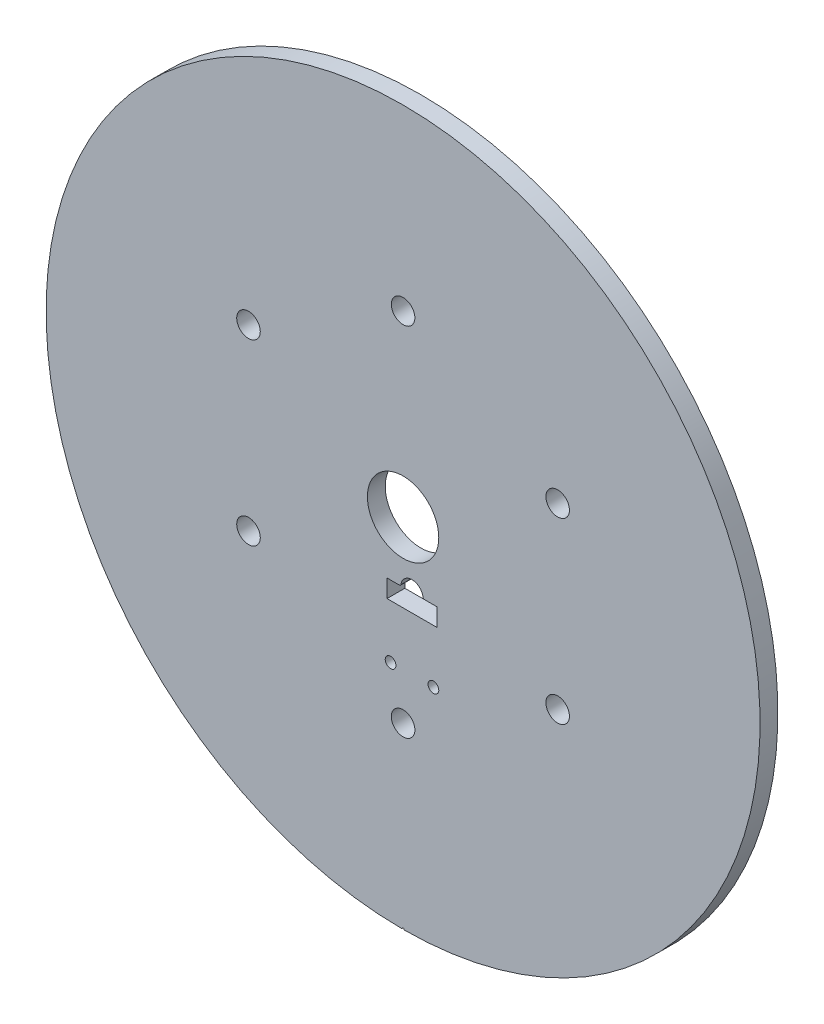
ISO-10303-21;
HEADER;
FILE_DESCRIPTION(('STEP AP214'),'2;1');
FILE_NAME('part.step','',(''),(''),'','','');
FILE_SCHEMA(('AUTOMOTIVE_DESIGN { 1 0 10303 214 1 1 1 1 }'));
ENDSEC;
DATA;
#1=APPLICATION_CONTEXT('core data for automotive mechanical design processes');
#2=APPLICATION_PROTOCOL_DEFINITION('international standard','automotive_design',2000,#1);
#3=PRODUCT_CONTEXT('',#1,'mechanical');
#4=PRODUCT('Part','Part','',(#3));
#5=PRODUCT_RELATED_PRODUCT_CATEGORY('part','',(#4));
#6=PRODUCT_DEFINITION_FORMATION('','',#4);
#7=PRODUCT_DEFINITION_CONTEXT('part definition',#1,'design');
#8=PRODUCT_DEFINITION('design','',#6,#7);
#9=PRODUCT_DEFINITION_SHAPE('','',#8);
#10=(LENGTH_UNIT() NAMED_UNIT(*) SI_UNIT(.MILLI.,.METRE.));
#11=(NAMED_UNIT(*) PLANE_ANGLE_UNIT() SI_UNIT($,.RADIAN.));
#12=(NAMED_UNIT(*) SI_UNIT($,.STERADIAN.) SOLID_ANGLE_UNIT());
#13=UNCERTAINTY_MEASURE_WITH_UNIT(LENGTH_MEASURE(1.E-05),#10,'distance_accuracy_value','');
#14=(GEOMETRIC_REPRESENTATION_CONTEXT(3) GLOBAL_UNCERTAINTY_ASSIGNED_CONTEXT((#13)) GLOBAL_UNIT_ASSIGNED_CONTEXT((#10,
#11,#12)) REPRESENTATION_CONTEXT('',''));
#15=CARTESIAN_POINT('',(0.,0.,0.));
#16=DIRECTION('',(0.,0.,1.));
#17=DIRECTION('',(1.,0.,0.));
#18=AXIS2_PLACEMENT_3D('',#15,#16,#17);
#19=CARTESIAN_POINT('',(0.,0.,5.));
#20=DIRECTION('',(0.,0.,1.));
#21=DIRECTION('',(1.,0.,0.));
#22=AXIS2_PLACEMENT_3D('',#19,#20,#21);
#23=PLANE('',#22);
#24=CARTESIAN_POINT('',(0.,0.,5.));
#25=DIRECTION('',(0.,0.,1.));
#26=DIRECTION('',(1.,0.,0.));
#27=AXIS2_PLACEMENT_3D('',#24,#25,#26);
#28=CIRCLE('',#27,10.0000000000051);
#29=CARTESIAN_POINT('',(10.0000000000051,0.,5.));
#30=VERTEX_POINT('',#29);
#31=EDGE_CURVE('E526',#30,#30,#28,.T.);
#32=ORIENTED_EDGE('',*,*,#31,.F.);
#33=EDGE_LOOP('',(#32));
#34=FACE_BOUND('',#33,.T.);
#35=CARTESIAN_POINT('',(8.5,-37.,5.));
#36=DIRECTION('',(0.,0.,-1.));
#37=DIRECTION('',(-1.,0.,0.));
#38=AXIS2_PLACEMENT_3D('',#35,#36,#37);
#39=CIRCLE('',#38,1.5);
#40=CARTESIAN_POINT('',(7.,-37.,5.));
#41=VERTEX_POINT('',#40);
#42=EDGE_CURVE('E536',#41,#41,#39,.T.);
#43=ORIENTED_EDGE('',*,*,#42,.T.);
#44=EDGE_LOOP('',(#43));
#45=FACE_BOUND('',#44,.T.);
#46=CARTESIAN_POINT('',(-3.5,-37.,5.));
#47=DIRECTION('',(0.,0.,-1.));
#48=DIRECTION('',(-1.,0.,0.));
#49=AXIS2_PLACEMENT_3D('',#46,#47,#48);
#50=CIRCLE('',#49,1.5);
#51=CARTESIAN_POINT('',(-5.,-37.,5.));
#52=VERTEX_POINT('',#51);
#53=EDGE_CURVE('E544',#52,#52,#50,.T.);
#54=ORIENTED_EDGE('',*,*,#53,.T.);
#55=EDGE_LOOP('',(#54));
#56=FACE_BOUND('',#55,.T.);
#57=DIRECTION('',(-1.,0.,0.));
#58=VECTOR('',#57,1.);
#59=CARTESIAN_POINT('',(9.5,-17.,5.));
#60=LINE('',#59,#58);
#61=CARTESIAN_POINT('',(-1.06510869399518,-17.,5.));
#62=VERTEX_POINT('',#61);
#63=CARTESIAN_POINT('',(-4.5,-17.,5.));
#64=VERTEX_POINT('',#63);
#65=EDGE_CURVE('E178',#62,#64,#60,.T.);
#66=ORIENTED_EDGE('',*,*,#65,.F.);
#67=CARTESIAN_POINT('',(-1.06510869399518,-16.5,5.));
#68=DIRECTION('',(0.,0.,1.));
#69=DIRECTION('',(1.,0.,0.));
#70=AXIS2_PLACEMENT_3D('',#67,#68,#69);
#71=CIRCLE('',#70,0.5);
#72=CARTESIAN_POINT('',(-0.56995470871807,-16.5694444444444,5.));
#73=VERTEX_POINT('',#72);
#74=EDGE_CURVE('E54',#62,#73,#71,.T.);
#75=ORIENTED_EDGE('',*,*,#74,.T.);
#76=CARTESIAN_POINT('',(2.5,-17.,5.));
#77=DIRECTION('',(0.,0.,-1.));
#78=DIRECTION('',(-1.,0.,0.));
#79=AXIS2_PLACEMENT_3D('',#76,#77,#78);
#80=CIRCLE('',#79,3.1);
#81=CARTESIAN_POINT('',(5.56995470871807,-16.5694444444444,5.));
#82=VERTEX_POINT('',#81);
#83=EDGE_CURVE('E176',#73,#82,#80,.T.);
#84=ORIENTED_EDGE('',*,*,#83,.T.);
#85=CARTESIAN_POINT('',(6.06510869399518,-16.5,5.));
#86=DIRECTION('',(0.,0.,1.));
#87=DIRECTION('',(1.,0.,0.));
#88=AXIS2_PLACEMENT_3D('',#85,#86,#87);
#89=CIRCLE('',#88,0.5);
#90=CARTESIAN_POINT('',(6.06510869399518,-17.,5.));
#91=VERTEX_POINT('',#90);
#92=EDGE_CURVE('E61',#82,#91,#89,.T.);
#93=ORIENTED_EDGE('',*,*,#92,.T.);
#94=CARTESIAN_POINT('',(9.5,-17.,5.));
#95=VERTEX_POINT('',#94);
#96=EDGE_CURVE('E216',#95,#91,#60,.T.);
#97=ORIENTED_EDGE('',*,*,#96,.F.);
#98=DIRECTION('',(0.,1.,0.));
#99=VECTOR('',#98,1.);
#100=CARTESIAN_POINT('',(9.5,-17.,5.));
#101=LINE('',#100,#99);
#102=CARTESIAN_POINT('',(9.5,-22.,5.));
#103=VERTEX_POINT('',#102);
#104=EDGE_CURVE('E560',#103,#95,#101,.T.);
#105=ORIENTED_EDGE('',*,*,#104,.F.);
#106=DIRECTION('',(1.,0.,0.));
#107=VECTOR('',#106,1.);
#108=CARTESIAN_POINT('',(9.5,-22.,5.));
#109=LINE('',#108,#107);
#110=CARTESIAN_POINT('',(-4.5,-22.,5.));
#111=VERTEX_POINT('',#110);
#112=EDGE_CURVE('E557',#111,#103,#109,.T.);
#113=ORIENTED_EDGE('',*,*,#112,.F.);
#114=DIRECTION('',(0.,-1.,0.));
#115=VECTOR('',#114,1.);
#116=CARTESIAN_POINT('',(-4.5,-17.,5.));
#117=LINE('',#116,#115);
#118=EDGE_CURVE('E207',#64,#111,#117,.T.);
#119=ORIENTED_EDGE('',*,*,#118,.F.);
#120=EDGE_LOOP('',(#66,#75,#84,#93,#97,#105,#113,#119));
#121=FACE_BOUND('',#120,.T.);
#122=CARTESIAN_POINT('',(0.,50.,5.));
#123=DIRECTION('',(0.,0.,1.));
#124=DIRECTION('',(1.,0.,0.));
#125=AXIS2_PLACEMENT_3D('',#122,#123,#124);
#126=CIRCLE('',#125,3.3);
#127=CARTESIAN_POINT('',(3.3,50.,5.));
#128=VERTEX_POINT('',#127);
#129=EDGE_CURVE('E226',#128,#128,#126,.T.);
#130=ORIENTED_EDGE('',*,*,#129,.F.);
#131=EDGE_LOOP('',(#130));
#132=FACE_BOUND('',#131,.T.);
#133=CARTESIAN_POINT('',(43.301270189222,24.9999999999999,5.));
#134=DIRECTION('',(0.,0.,1.));
#135=DIRECTION('',(1.,0.,0.));
#136=AXIS2_PLACEMENT_3D('',#133,#134,#135);
#137=CIRCLE('',#136,3.3);
#138=CARTESIAN_POINT('',(46.601270189222,24.9999999999999,5.));
#139=VERTEX_POINT('',#138);
#140=EDGE_CURVE('E234',#139,#139,#137,.T.);
#141=ORIENTED_EDGE('',*,*,#140,.F.);
#142=EDGE_LOOP('',(#141));
#143=FACE_BOUND('',#142,.T.);
#144=CARTESIAN_POINT('',(43.3012701892218,-25.0000000000002,5.));
#145=DIRECTION('',(0.,0.,1.));
#146=DIRECTION('',(1.,0.,0.));
#147=AXIS2_PLACEMENT_3D('',#144,#145,#146);
#148=CIRCLE('',#147,3.3);
#149=CARTESIAN_POINT('',(46.6012701892218,-25.0000000000002,5.));
#150=VERTEX_POINT('',#149);
#151=EDGE_CURVE('E242',#150,#150,#148,.T.);
#152=ORIENTED_EDGE('',*,*,#151,.F.);
#153=EDGE_LOOP('',(#152));
#154=FACE_BOUND('',#153,.T.);
#155=CARTESIAN_POINT('',(0.,-50.,5.));
#156=DIRECTION('',(0.,0.,1.));
#157=DIRECTION('',(1.,0.,0.));
#158=AXIS2_PLACEMENT_3D('',#155,#156,#157);
#159=CIRCLE('',#158,3.3);
#160=CARTESIAN_POINT('',(3.3,-50.,5.));
#161=VERTEX_POINT('',#160);
#162=EDGE_CURVE('E250',#161,#161,#159,.T.);
#163=ORIENTED_EDGE('',*,*,#162,.F.);
#164=EDGE_LOOP('',(#163));
#165=FACE_BOUND('',#164,.T.);
#166=CARTESIAN_POINT('',(-43.3012701892222,-24.9999999999996,5.));
#167=DIRECTION('',(0.,0.,1.));
#168=DIRECTION('',(1.,0.,0.));
#169=AXIS2_PLACEMENT_3D('',#166,#167,#168);
#170=CIRCLE('',#169,3.3);
#171=CARTESIAN_POINT('',(-40.0012701892222,-24.9999999999996,5.));
#172=VERTEX_POINT('',#171);
#173=EDGE_CURVE('E258',#172,#172,#170,.T.);
#174=ORIENTED_EDGE('',*,*,#173,.F.);
#175=EDGE_LOOP('',(#174));
#176=FACE_BOUND('',#175,.T.);
#177=CARTESIAN_POINT('',(-43.3012701892216,25.0000000000005,5.));
#178=DIRECTION('',(0.,0.,1.));
#179=DIRECTION('',(1.,0.,0.));
#180=AXIS2_PLACEMENT_3D('',#177,#178,#179);
#181=CIRCLE('',#180,3.3);
#182=CARTESIAN_POINT('',(-40.0012701892216,25.0000000000005,5.));
#183=VERTEX_POINT('',#182);
#184=EDGE_CURVE('E265',#183,#183,#181,.T.);
#185=ORIENTED_EDGE('',*,*,#184,.F.);
#186=EDGE_LOOP('',(#185));
#187=FACE_BOUND('',#186,.T.);
#188=CARTESIAN_POINT('',(0.,0.,5.));
#189=DIRECTION('',(0.,0.,1.));
#190=DIRECTION('',(1.,0.,0.));
#191=AXIS2_PLACEMENT_3D('',#188,#189,#190);
#192=CIRCLE('',#191,100.);
#193=CARTESIAN_POINT('',(0.330199549969947,-99.9994548398,5.));
#194=VERTEX_POINT('',#193);
#195=CARTESIAN_POINT('',(-0.330199549969947,-99.9994548398,5.));
#196=VERTEX_POINT('',#195);
#197=EDGE_CURVE('E140',#194,#196,#192,.T.);
#198=ORIENTED_EDGE('',*,*,#197,.T.);
#199=CARTESIAN_POINT('',(0.,-100.,5.));
#200=DIRECTION('',(0.,0.,-1.));
#201=DIRECTION('',(-1.,0.,0.));
#202=AXIS2_PLACEMENT_3D('',#199,#200,#201);
#203=CIRCLE('',#202,0.330199999999999);
#204=EDGE_CURVE('E123',#196,#194,#203,.T.);
#205=ORIENTED_EDGE('',*,*,#204,.T.);
#206=EDGE_LOOP('',(#198,#205));
#207=FACE_BOUND('',#206,.T.);
#208=ADVANCED_FACE('F45',(#34,#45,#56,#121,#132,#143,#154,#165,#176,#187,#207),#23,.T.);
#209=CARTESIAN_POINT('',(0.,0.,0.));
#210=DIRECTION('',(0.,0.,1.));
#211=DIRECTION('',(1.,0.,0.));
#212=AXIS2_PLACEMENT_3D('',#209,#210,#211);
#213=PLANE('',#212);
#214=CARTESIAN_POINT('',(0.,0.,0.));
#215=DIRECTION('',(0.,0.,1.));
#216=DIRECTION('',(1.,0.,0.));
#217=AXIS2_PLACEMENT_3D('',#214,#215,#216);
#218=CIRCLE('',#217,10.0000000000051);
#219=CARTESIAN_POINT('',(10.0000000000051,0.,0.));
#220=VERTEX_POINT('',#219);
#221=EDGE_CURVE('E529',#220,#220,#218,.T.);
#222=ORIENTED_EDGE('',*,*,#221,.T.);
#223=EDGE_LOOP('',(#222));
#224=FACE_BOUND('',#223,.T.);
#225=CARTESIAN_POINT('',(8.5,-37.,0.));
#226=DIRECTION('',(0.,0.,-1.));
#227=DIRECTION('',(-1.,0.,0.));
#228=AXIS2_PLACEMENT_3D('',#225,#226,#227);
#229=CIRCLE('',#228,1.5);
#230=CARTESIAN_POINT('',(7.,-37.,0.));
#231=VERTEX_POINT('',#230);
#232=EDGE_CURVE('E540',#231,#231,#229,.T.);
#233=ORIENTED_EDGE('',*,*,#232,.F.);
#234=EDGE_LOOP('',(#233));
#235=FACE_BOUND('',#234,.T.);
#236=CARTESIAN_POINT('',(-3.5,-37.,0.));
#237=DIRECTION('',(0.,0.,-1.));
#238=DIRECTION('',(-1.,0.,0.));
#239=AXIS2_PLACEMENT_3D('',#236,#237,#238);
#240=CIRCLE('',#239,1.5);
#241=CARTESIAN_POINT('',(-5.,-37.,0.));
#242=VERTEX_POINT('',#241);
#243=EDGE_CURVE('E533',#242,#242,#240,.T.);
#244=ORIENTED_EDGE('',*,*,#243,.F.);
#245=EDGE_LOOP('',(#244));
#246=FACE_BOUND('',#245,.T.);
#247=CARTESIAN_POINT('',(2.5,-17.,0.));
#248=DIRECTION('',(0.,0.,-1.));
#249=DIRECTION('',(-1.,0.,0.));
#250=AXIS2_PLACEMENT_3D('',#247,#248,#249);
#251=CIRCLE('',#250,3.1);
#252=CARTESIAN_POINT('',(-0.56995470871807,-16.5694444444444,0.));
#253=VERTEX_POINT('',#252);
#254=CARTESIAN_POINT('',(5.56995470871807,-16.5694444444444,0.));
#255=VERTEX_POINT('',#254);
#256=EDGE_CURVE('E134',#253,#255,#251,.T.);
#257=ORIENTED_EDGE('',*,*,#256,.F.);
#258=CARTESIAN_POINT('',(-1.06510869399518,-16.5,0.));
#259=DIRECTION('',(0.,0.,1.));
#260=DIRECTION('',(1.,0.,0.));
#261=AXIS2_PLACEMENT_3D('',#258,#259,#260);
#262=CIRCLE('',#261,0.5);
#263=CARTESIAN_POINT('',(-1.06510869399518,-17.,0.));
#264=VERTEX_POINT('',#263);
#265=EDGE_CURVE('E166',#253,#264,#262,.F.);
#266=ORIENTED_EDGE('',*,*,#265,.T.);
#267=DIRECTION('',(-1.,0.,0.));
#268=VECTOR('',#267,1.);
#269=CARTESIAN_POINT('',(9.5,-17.,0.));
#270=LINE('',#269,#268);
#271=CARTESIAN_POINT('',(-4.5,-17.,0.));
#272=VERTEX_POINT('',#271);
#273=EDGE_CURVE('E194',#264,#272,#270,.T.);
#274=ORIENTED_EDGE('',*,*,#273,.T.);
#275=DIRECTION('',(0.,-1.,0.));
#276=VECTOR('',#275,1.);
#277=CARTESIAN_POINT('',(-4.5,-17.,0.));
#278=LINE('',#277,#276);
#279=CARTESIAN_POINT('',(-4.5,-22.,0.));
#280=VERTEX_POINT('',#279);
#281=EDGE_CURVE('E187',#272,#280,#278,.T.);
#282=ORIENTED_EDGE('',*,*,#281,.T.);
#283=DIRECTION('',(1.,0.,0.));
#284=VECTOR('',#283,1.);
#285=CARTESIAN_POINT('',(9.5,-22.,0.));
#286=LINE('',#285,#284);
#287=CARTESIAN_POINT('',(9.5,-22.,0.));
#288=VERTEX_POINT('',#287);
#289=EDGE_CURVE('E209',#280,#288,#286,.T.);
#290=ORIENTED_EDGE('',*,*,#289,.T.);
#291=DIRECTION('',(0.,1.,0.));
#292=VECTOR('',#291,1.);
#293=CARTESIAN_POINT('',(9.5,-17.,0.));
#294=LINE('',#293,#292);
#295=CARTESIAN_POINT('',(9.5,-17.,0.));
#296=VERTEX_POINT('',#295);
#297=EDGE_CURVE('E202',#288,#296,#294,.T.);
#298=ORIENTED_EDGE('',*,*,#297,.T.);
#299=CARTESIAN_POINT('',(6.06510869399518,-17.,0.));
#300=VERTEX_POINT('',#299);
#301=EDGE_CURVE('E201',#296,#300,#270,.T.);
#302=ORIENTED_EDGE('',*,*,#301,.T.);
#303=CARTESIAN_POINT('',(6.06510869399518,-16.5,0.));
#304=DIRECTION('',(0.,0.,1.));
#305=DIRECTION('',(1.,0.,0.));
#306=AXIS2_PLACEMENT_3D('',#303,#304,#305);
#307=CIRCLE('',#306,0.5);
#308=EDGE_CURVE('E163',#300,#255,#307,.F.);
#309=ORIENTED_EDGE('',*,*,#308,.T.);
#310=EDGE_LOOP('',(#257,#266,#274,#282,#290,#298,#302,#309));
#311=FACE_BOUND('',#310,.T.);
#312=CARTESIAN_POINT('',(0.,50.,0.));
#313=DIRECTION('',(0.,0.,1.));
#314=DIRECTION('',(1.,0.,0.));
#315=AXIS2_PLACEMENT_3D('',#312,#313,#314);
#316=CIRCLE('',#315,3.3);
#317=CARTESIAN_POINT('',(3.3,50.,0.));
#318=VERTEX_POINT('',#317);
#319=EDGE_CURVE('E230',#318,#318,#316,.T.);
#320=ORIENTED_EDGE('',*,*,#319,.T.);
#321=EDGE_LOOP('',(#320));
#322=FACE_BOUND('',#321,.T.);
#323=CARTESIAN_POINT('',(43.301270189222,24.9999999999999,0.));
#324=DIRECTION('',(0.,0.,1.));
#325=DIRECTION('',(1.,0.,0.));
#326=AXIS2_PLACEMENT_3D('',#323,#324,#325);
#327=CIRCLE('',#326,3.3);
#328=CARTESIAN_POINT('',(46.601270189222,24.9999999999999,0.));
#329=VERTEX_POINT('',#328);
#330=EDGE_CURVE('E238',#329,#329,#327,.T.);
#331=ORIENTED_EDGE('',*,*,#330,.T.);
#332=EDGE_LOOP('',(#331));
#333=FACE_BOUND('',#332,.T.);
#334=CARTESIAN_POINT('',(43.3012701892218,-25.0000000000002,0.));
#335=DIRECTION('',(0.,0.,1.));
#336=DIRECTION('',(1.,0.,0.));
#337=AXIS2_PLACEMENT_3D('',#334,#335,#336);
#338=CIRCLE('',#337,3.3);
#339=CARTESIAN_POINT('',(46.6012701892218,-25.0000000000002,0.));
#340=VERTEX_POINT('',#339);
#341=EDGE_CURVE('E246',#340,#340,#338,.T.);
#342=ORIENTED_EDGE('',*,*,#341,.T.);
#343=EDGE_LOOP('',(#342));
#344=FACE_BOUND('',#343,.T.);
#345=CARTESIAN_POINT('',(0.,-50.,0.));
#346=DIRECTION('',(0.,0.,1.));
#347=DIRECTION('',(1.,0.,0.));
#348=AXIS2_PLACEMENT_3D('',#345,#346,#347);
#349=CIRCLE('',#348,3.3);
#350=CARTESIAN_POINT('',(3.3,-50.,0.));
#351=VERTEX_POINT('',#350);
#352=EDGE_CURVE('E254',#351,#351,#349,.T.);
#353=ORIENTED_EDGE('',*,*,#352,.T.);
#354=EDGE_LOOP('',(#353));
#355=FACE_BOUND('',#354,.T.);
#356=CARTESIAN_POINT('',(-43.3012701892222,-24.9999999999996,0.));
#357=DIRECTION('',(0.,0.,1.));
#358=DIRECTION('',(1.,0.,0.));
#359=AXIS2_PLACEMENT_3D('',#356,#357,#358);
#360=CIRCLE('',#359,3.3);
#361=CARTESIAN_POINT('',(-40.0012701892222,-24.9999999999996,0.));
#362=VERTEX_POINT('',#361);
#363=EDGE_CURVE('E262',#362,#362,#360,.T.);
#364=ORIENTED_EDGE('',*,*,#363,.T.);
#365=EDGE_LOOP('',(#364));
#366=FACE_BOUND('',#365,.T.);
#367=CARTESIAN_POINT('',(-43.3012701892216,25.0000000000005,0.));
#368=DIRECTION('',(0.,0.,1.));
#369=DIRECTION('',(1.,0.,0.));
#370=AXIS2_PLACEMENT_3D('',#367,#368,#369);
#371=CIRCLE('',#370,3.3);
#372=CARTESIAN_POINT('',(-40.0012701892216,25.0000000000005,0.));
#373=VERTEX_POINT('',#372);
#374=EDGE_CURVE('E151',#373,#373,#371,.T.);
#375=ORIENTED_EDGE('',*,*,#374,.T.);
#376=EDGE_LOOP('',(#375));
#377=FACE_BOUND('',#376,.T.);
#378=CARTESIAN_POINT('',(0.,-100.,0.));
#379=DIRECTION('',(0.,0.,-1.));
#380=DIRECTION('',(-1.,0.,0.));
#381=AXIS2_PLACEMENT_3D('',#378,#379,#380);
#382=CIRCLE('',#381,0.3302);
#383=CARTESIAN_POINT('',(-0.330199549969948,-99.9994548398,0.));
#384=VERTEX_POINT('',#383);
#385=CARTESIAN_POINT('',(0.330199549969975,-99.9994548398,0.));
#386=VERTEX_POINT('',#385);
#387=EDGE_CURVE('E135',#384,#386,#382,.T.);
#388=ORIENTED_EDGE('',*,*,#387,.F.);
#389=CARTESIAN_POINT('',(0.,0.,0.));
#390=DIRECTION('',(0.,0.,1.));
#391=DIRECTION('',(1.,0.,0.));
#392=AXIS2_PLACEMENT_3D('',#389,#390,#391);
#393=CIRCLE('',#392,100.);
#394=EDGE_CURVE('E142',#386,#384,#393,.T.);
#395=ORIENTED_EDGE('',*,*,#394,.F.);
#396=EDGE_LOOP('',(#388,#395));
#397=FACE_BOUND('',#396,.T.);
#398=ADVANCED_FACE('F191',(#224,#235,#246,#311,#322,#333,#344,#355,#366,#377,#397),#213,.F.);
#399=CARTESIAN_POINT('',(9.5,-17.,5.));
#400=DIRECTION('',(0.,-1.,0.));
#401=DIRECTION('',(0.,0.,-1.));
#402=AXIS2_PLACEMENT_3D('',#399,#400,#401);
#403=PLANE('',#402);
#404=ORIENTED_EDGE('',*,*,#273,.F.);
#405=DIRECTION('',(0.,0.,1.));
#406=VECTOR('',#405,1.);
#407=CARTESIAN_POINT('',(-1.06510869399518,-17.,5.));
#408=LINE('',#407,#406);
#409=EDGE_CURVE('E69',#264,#62,#408,.T.);
#410=ORIENTED_EDGE('',*,*,#409,.T.);
#411=ORIENTED_EDGE('',*,*,#65,.T.);
#412=DIRECTION('',(0.,0.,-1.));
#413=VECTOR('',#412,1.);
#414=CARTESIAN_POINT('',(-4.5,-17.,5.));
#415=LINE('',#414,#413);
#416=EDGE_CURVE('E199',#64,#272,#415,.T.);
#417=ORIENTED_EDGE('',*,*,#416,.T.);
#418=EDGE_LOOP('',(#404,#410,#411,#417));
#419=FACE_BOUND('',#418,.T.);
#420=ADVANCED_FACE('F197',(#419),#403,.T.);
#421=CARTESIAN_POINT('',(0.,0.,5.));
#422=DIRECTION('',(0.,0.,-1.));
#423=DIRECTION('',(-1.,0.,0.));
#424=AXIS2_PLACEMENT_3D('',#421,#422,#423);
#425=CYLINDRICAL_SURFACE('',#424,100.);
#426=ORIENTED_EDGE('',*,*,#394,.T.);
#427=DIRECTION('',(0.,0.,-1.));
#428=VECTOR('',#427,1.);
#429=CARTESIAN_POINT('',(-0.330199549969948,-99.9994548398,2.5));
#430=LINE('',#429,#428);
#431=EDGE_CURVE('E126',#384,#196,#430,.F.);
#432=ORIENTED_EDGE('',*,*,#431,.T.);
#433=ORIENTED_EDGE('',*,*,#197,.F.);
#434=DIRECTION('',(0.,0.,-1.));
#435=VECTOR('',#434,1.);
#436=CARTESIAN_POINT('',(0.330199549969948,-99.9994548398,2.5));
#437=LINE('',#436,#435);
#438=EDGE_CURVE('E129',#194,#386,#437,.T.);
#439=ORIENTED_EDGE('',*,*,#438,.T.);
#440=EDGE_LOOP('',(#426,#432,#433,#439));
#441=FACE_BOUND('',#440,.T.);
#442=ADVANCED_FACE('F139',(#441),#425,.T.);
#443=CARTESIAN_POINT('',(-43.3012701892216,25.0000000000005,5.));
#444=DIRECTION('',(0.,0.,1.));
#445=DIRECTION('',(1.,0.,0.));
#446=AXIS2_PLACEMENT_3D('',#443,#444,#445);
#447=CYLINDRICAL_SURFACE('',#446,3.3);
#448=ORIENTED_EDGE('',*,*,#374,.F.);
#449=EDGE_LOOP('',(#448));
#450=FACE_BOUND('',#449,.T.);
#451=ORIENTED_EDGE('',*,*,#184,.T.);
#452=EDGE_LOOP('',(#451));
#453=FACE_BOUND('',#452,.T.);
#454=ADVANCED_FACE('F276',(#450,#453),#447,.F.);
#455=CARTESIAN_POINT('',(-43.3012701892222,-24.9999999999996,5.));
#456=DIRECTION('',(0.,0.,1.));
#457=DIRECTION('',(1.,0.,0.));
#458=AXIS2_PLACEMENT_3D('',#455,#456,#457);
#459=CYLINDRICAL_SURFACE('',#458,3.3);
#460=ORIENTED_EDGE('',*,*,#363,.F.);
#461=EDGE_LOOP('',(#460));
#462=FACE_BOUND('',#461,.T.);
#463=ORIENTED_EDGE('',*,*,#173,.T.);
#464=EDGE_LOOP('',(#463));
#465=FACE_BOUND('',#464,.T.);
#466=ADVANCED_FACE('F278',(#462,#465),#459,.F.);
#467=CARTESIAN_POINT('',(0.,-50.,5.));
#468=DIRECTION('',(0.,0.,1.));
#469=DIRECTION('',(1.,0.,0.));
#470=AXIS2_PLACEMENT_3D('',#467,#468,#469);
#471=CYLINDRICAL_SURFACE('',#470,3.3);
#472=ORIENTED_EDGE('',*,*,#352,.F.);
#473=EDGE_LOOP('',(#472));
#474=FACE_BOUND('',#473,.T.);
#475=ORIENTED_EDGE('',*,*,#162,.T.);
#476=EDGE_LOOP('',(#475));
#477=FACE_BOUND('',#476,.T.);
#478=ADVANCED_FACE('F284',(#474,#477),#471,.F.);
#479=CARTESIAN_POINT('',(43.3012701892218,-25.0000000000002,5.));
#480=DIRECTION('',(0.,0.,1.));
#481=DIRECTION('',(1.,0.,0.));
#482=AXIS2_PLACEMENT_3D('',#479,#480,#481);
#483=CYLINDRICAL_SURFACE('',#482,3.3);
#484=ORIENTED_EDGE('',*,*,#341,.F.);
#485=EDGE_LOOP('',(#484));
#486=FACE_BOUND('',#485,.T.);
#487=ORIENTED_EDGE('',*,*,#151,.T.);
#488=EDGE_LOOP('',(#487));
#489=FACE_BOUND('',#488,.T.);
#490=ADVANCED_FACE('F336',(#486,#489),#483,.F.);
#491=CARTESIAN_POINT('',(43.301270189222,24.9999999999999,5.));
#492=DIRECTION('',(0.,0.,1.));
#493=DIRECTION('',(1.,0.,0.));
#494=AXIS2_PLACEMENT_3D('',#491,#492,#493);
#495=CYLINDRICAL_SURFACE('',#494,3.3);
#496=ORIENTED_EDGE('',*,*,#330,.F.);
#497=EDGE_LOOP('',(#496));
#498=FACE_BOUND('',#497,.T.);
#499=ORIENTED_EDGE('',*,*,#140,.T.);
#500=EDGE_LOOP('',(#499));
#501=FACE_BOUND('',#500,.T.);
#502=ADVANCED_FACE('F332',(#498,#501),#495,.F.);
#503=CARTESIAN_POINT('',(0.,50.,5.));
#504=DIRECTION('',(0.,0.,1.));
#505=DIRECTION('',(1.,0.,0.));
#506=AXIS2_PLACEMENT_3D('',#503,#504,#505);
#507=CYLINDRICAL_SURFACE('',#506,3.3);
#508=ORIENTED_EDGE('',*,*,#319,.F.);
#509=EDGE_LOOP('',(#508));
#510=FACE_BOUND('',#509,.T.);
#511=ORIENTED_EDGE('',*,*,#129,.T.);
#512=EDGE_LOOP('',(#511));
#513=FACE_BOUND('',#512,.T.);
#514=ADVANCED_FACE('F328',(#510,#513),#507,.F.);
#515=CARTESIAN_POINT('',(-4.5,-17.,5.));
#516=DIRECTION('',(1.,0.,0.));
#517=DIRECTION('',(0.,1.,0.));
#518=AXIS2_PLACEMENT_3D('',#515,#516,#517);
#519=PLANE('',#518);
#520=ORIENTED_EDGE('',*,*,#281,.F.);
#521=ORIENTED_EDGE('',*,*,#416,.F.);
#522=ORIENTED_EDGE('',*,*,#118,.T.);
#523=DIRECTION('',(0.,0.,-1.));
#524=VECTOR('',#523,1.);
#525=CARTESIAN_POINT('',(-4.5,-22.,5.));
#526=LINE('',#525,#524);
#527=EDGE_CURVE('E222',#111,#280,#526,.T.);
#528=ORIENTED_EDGE('',*,*,#527,.T.);
#529=EDGE_LOOP('',(#520,#521,#522,#528));
#530=FACE_BOUND('',#529,.T.);
#531=ADVANCED_FACE('F324',(#530),#519,.T.);
#532=CARTESIAN_POINT('',(9.5,-22.,5.));
#533=DIRECTION('',(0.,1.,0.));
#534=DIRECTION('',(0.,0.,1.));
#535=AXIS2_PLACEMENT_3D('',#532,#533,#534);
#536=PLANE('',#535);
#537=ORIENTED_EDGE('',*,*,#289,.F.);
#538=ORIENTED_EDGE('',*,*,#527,.F.);
#539=ORIENTED_EDGE('',*,*,#112,.T.);
#540=DIRECTION('',(0.,0.,-1.));
#541=VECTOR('',#540,1.);
#542=CARTESIAN_POINT('',(9.5,-22.,5.));
#543=LINE('',#542,#541);
#544=EDGE_CURVE('E219',#103,#288,#543,.T.);
#545=ORIENTED_EDGE('',*,*,#544,.T.);
#546=EDGE_LOOP('',(#537,#538,#539,#545));
#547=FACE_BOUND('',#546,.T.);
#548=ADVANCED_FACE('F320',(#547),#536,.T.);
#549=CARTESIAN_POINT('',(9.5,-17.,5.));
#550=DIRECTION('',(-1.,0.,0.));
#551=DIRECTION('',(0.,0.,1.));
#552=AXIS2_PLACEMENT_3D('',#549,#550,#551);
#553=PLANE('',#552);
#554=ORIENTED_EDGE('',*,*,#297,.F.);
#555=ORIENTED_EDGE('',*,*,#544,.F.);
#556=ORIENTED_EDGE('',*,*,#104,.T.);
#557=DIRECTION('',(0.,0.,-1.));
#558=VECTOR('',#557,1.);
#559=CARTESIAN_POINT('',(9.5,-17.,5.));
#560=LINE('',#559,#558);
#561=EDGE_CURVE('E215',#95,#296,#560,.T.);
#562=ORIENTED_EDGE('',*,*,#561,.T.);
#563=EDGE_LOOP('',(#554,#555,#556,#562));
#564=FACE_BOUND('',#563,.T.);
#565=ADVANCED_FACE('F316',(#564),#553,.T.);
#566=ORIENTED_EDGE('',*,*,#96,.T.);
#567=DIRECTION('',(0.,0.,1.));
#568=VECTOR('',#567,1.);
#569=CARTESIAN_POINT('',(6.06510869399518,-17.,0.));
#570=LINE('',#569,#568);
#571=EDGE_CURVE('E11',#91,#300,#570,.F.);
#572=ORIENTED_EDGE('',*,*,#571,.T.);
#573=ORIENTED_EDGE('',*,*,#301,.F.);
#574=ORIENTED_EDGE('',*,*,#561,.F.);
#575=EDGE_LOOP('',(#566,#572,#573,#574));
#576=FACE_BOUND('',#575,.T.);
#577=ADVANCED_FACE('F309',(#576),#403,.T.);
#578=CARTESIAN_POINT('',(2.5,-17.,5.));
#579=DIRECTION('',(0.,0.,-1.));
#580=DIRECTION('',(-1.,0.,0.));
#581=AXIS2_PLACEMENT_3D('',#578,#579,#580);
#582=CYLINDRICAL_SURFACE('',#581,3.1);
#583=ORIENTED_EDGE('',*,*,#83,.F.);
#584=DIRECTION('',(0.,0.,-1.));
#585=VECTOR('',#584,1.);
#586=CARTESIAN_POINT('',(-0.56995470871807,-16.5694444444444,5.));
#587=LINE('',#586,#585);
#588=EDGE_CURVE('E159',#73,#253,#587,.T.);
#589=ORIENTED_EDGE('',*,*,#588,.T.);
#590=ORIENTED_EDGE('',*,*,#256,.T.);
#591=DIRECTION('',(0.,0.,-1.));
#592=VECTOR('',#591,1.);
#593=CARTESIAN_POINT('',(5.56995470871807,-16.5694444444444,5.));
#594=LINE('',#593,#592);
#595=EDGE_CURVE('E144',#255,#82,#594,.F.);
#596=ORIENTED_EDGE('',*,*,#595,.T.);
#597=EDGE_LOOP('',(#583,#589,#590,#596));
#598=FACE_BOUND('',#597,.T.);
#599=ADVANCED_FACE('F182',(#598),#582,.F.);
#600=CARTESIAN_POINT('',(0.,-100.,0.));
#601=DIRECTION('',(0.,0.,-1.));
#602=DIRECTION('',(-1.,0.,0.));
#603=AXIS2_PLACEMENT_3D('',#600,#601,#602);
#604=CYLINDRICAL_SURFACE('',#603,0.3302);
#605=ORIENTED_EDGE('',*,*,#387,.T.);
#606=ORIENTED_EDGE('',*,*,#438,.F.);
#607=ORIENTED_EDGE('',*,*,#204,.F.);
#608=ORIENTED_EDGE('',*,*,#431,.F.);
#609=EDGE_LOOP('',(#605,#606,#607,#608));
#610=FACE_BOUND('',#609,.T.);
#611=ADVANCED_FACE('F125',(#610),#604,.F.);
#612=CARTESIAN_POINT('',(-1.06510869399518,-16.5,5.));
#613=DIRECTION('',(0.,0.,-1.));
#614=DIRECTION('',(-1.,0.,0.));
#615=AXIS2_PLACEMENT_3D('',#612,#613,#614);
#616=CYLINDRICAL_SURFACE('',#615,0.5);
#617=ORIENTED_EDGE('',*,*,#74,.F.);
#618=ORIENTED_EDGE('',*,*,#409,.F.);
#619=ORIENTED_EDGE('',*,*,#265,.F.);
#620=ORIENTED_EDGE('',*,*,#588,.F.);
#621=EDGE_LOOP('',(#617,#618,#619,#620));
#622=FACE_BOUND('',#621,.T.);
#623=ADVANCED_FACE('F189',(#622),#616,.T.);
#624=CARTESIAN_POINT('',(6.06510869399518,-16.5,5.));
#625=DIRECTION('',(0.,0.,-1.));
#626=DIRECTION('',(-1.,0.,0.));
#627=AXIS2_PLACEMENT_3D('',#624,#625,#626);
#628=CYLINDRICAL_SURFACE('',#627,0.5);
#629=ORIENTED_EDGE('',*,*,#308,.F.);
#630=ORIENTED_EDGE('',*,*,#571,.F.);
#631=ORIENTED_EDGE('',*,*,#92,.F.);
#632=ORIENTED_EDGE('',*,*,#595,.F.);
#633=EDGE_LOOP('',(#629,#630,#631,#632));
#634=FACE_BOUND('',#633,.T.);
#635=ADVANCED_FACE('F47',(#634),#628,.T.);
#636=CARTESIAN_POINT('',(-3.5,-37.,5.));
#637=DIRECTION('',(0.,0.,-1.));
#638=DIRECTION('',(-1.,0.,0.));
#639=AXIS2_PLACEMENT_3D('',#636,#637,#638);
#640=CYLINDRICAL_SURFACE('',#639,1.5);
#641=ORIENTED_EDGE('',*,*,#53,.F.);
#642=EDGE_LOOP('',(#641));
#643=FACE_BOUND('',#642,.T.);
#644=ORIENTED_EDGE('',*,*,#243,.T.);
#645=EDGE_LOOP('',(#644));
#646=FACE_BOUND('',#645,.T.);
#647=ADVANCED_FACE('F303',(#643,#646),#640,.F.);
#648=CARTESIAN_POINT('',(8.5,-37.,5.));
#649=DIRECTION('',(0.,0.,-1.));
#650=DIRECTION('',(-1.,0.,0.));
#651=AXIS2_PLACEMENT_3D('',#648,#649,#650);
#652=CYLINDRICAL_SURFACE('',#651,1.5);
#653=ORIENTED_EDGE('',*,*,#42,.F.);
#654=EDGE_LOOP('',(#653));
#655=FACE_BOUND('',#654,.T.);
#656=ORIENTED_EDGE('',*,*,#232,.T.);
#657=EDGE_LOOP('',(#656));
#658=FACE_BOUND('',#657,.T.);
#659=ADVANCED_FACE('F417',(#655,#658),#652,.F.);
#660=CARTESIAN_POINT('',(0.,0.,5.));
#661=DIRECTION('',(0.,0.,-1.));
#662=DIRECTION('',(-1.,0.,0.));
#663=AXIS2_PLACEMENT_3D('',#660,#661,#662);
#664=CYLINDRICAL_SURFACE('',#663,10.0000000000051);
#665=ORIENTED_EDGE('',*,*,#31,.T.);
#666=EDGE_LOOP('',(#665));
#667=FACE_BOUND('',#666,.T.);
#668=ORIENTED_EDGE('',*,*,#221,.F.);
#669=EDGE_LOOP('',(#668));
#670=FACE_BOUND('',#669,.T.);
#671=ADVANCED_FACE('F426',(#667,#670),#664,.F.);
#672=CLOSED_SHELL('',(#208,#398,#420,#442,#454,#466,#478,#490,#502,#514,#531,#548,#565,#577,
#599,#611,#623,#635,#647,#659,#671));
#673=MANIFOLD_SOLID_BREP('B2',#672);
#674=ADVANCED_BREP_SHAPE_REPRESENTATION('',(#18,#673),#14);
#675=SHAPE_DEFINITION_REPRESENTATION(#9,#674);
ENDSEC;
END-ISO-10303-21;
